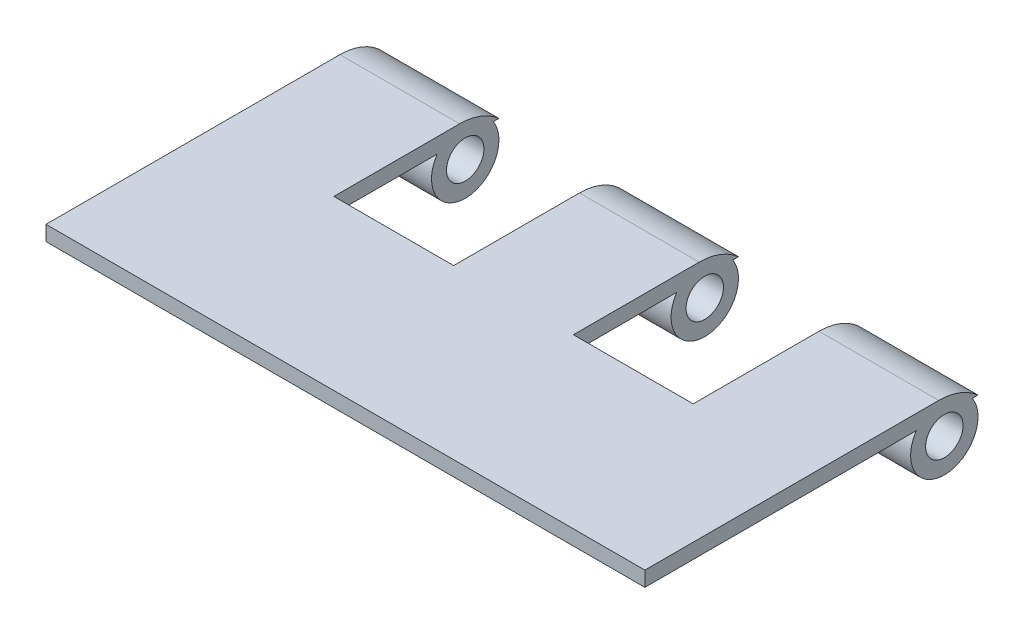
ISO-10303-21;
HEADER;
FILE_DESCRIPTION(('STEP AP214'),'2;1');
FILE_NAME('part.step','',(''),(''),'','','');
FILE_SCHEMA(('AUTOMOTIVE_DESIGN { 1 0 10303 214 1 1 1 1 }'));
ENDSEC;
DATA;
#1=APPLICATION_CONTEXT('core data for automotive mechanical design processes');
#2=APPLICATION_PROTOCOL_DEFINITION('international standard','automotive_design',2000,#1);
#3=PRODUCT_CONTEXT('',#1,'mechanical');
#4=PRODUCT('Part','Part','',(#3));
#5=PRODUCT_RELATED_PRODUCT_CATEGORY('part','',(#4));
#6=PRODUCT_DEFINITION_FORMATION('','',#4);
#7=PRODUCT_DEFINITION_CONTEXT('part definition',#1,'design');
#8=PRODUCT_DEFINITION('design','',#6,#7);
#9=PRODUCT_DEFINITION_SHAPE('','',#8);
#10=(LENGTH_UNIT() NAMED_UNIT(*) SI_UNIT(.MILLI.,.METRE.));
#11=(NAMED_UNIT(*) PLANE_ANGLE_UNIT() SI_UNIT($,.RADIAN.));
#12=(NAMED_UNIT(*) SI_UNIT($,.STERADIAN.) SOLID_ANGLE_UNIT());
#13=UNCERTAINTY_MEASURE_WITH_UNIT(LENGTH_MEASURE(1.E-05),#10,'distance_accuracy_value','');
#14=(GEOMETRIC_REPRESENTATION_CONTEXT(3) GLOBAL_UNCERTAINTY_ASSIGNED_CONTEXT((#13)) GLOBAL_UNIT_ASSIGNED_CONTEXT((#10,
#11,#12)) REPRESENTATION_CONTEXT('',''));
#15=CARTESIAN_POINT('',(0.,0.,0.));
#16=DIRECTION('',(0.,0.,1.));
#17=DIRECTION('',(1.,0.,0.));
#18=AXIS2_PLACEMENT_3D('',#15,#16,#17);
#19=CARTESIAN_POINT('',(-15.8109864269688,-0.79375,-13.4638514395932));
#20=DIRECTION('',(1.,0.,0.));
#21=DIRECTION('',(0.,0.,-1.));
#22=AXIS2_PLACEMENT_3D('',#19,#20,#21);
#23=CYLINDRICAL_SURFACE('',#22,1.42875);
#24=DIRECTION('',(1.,0.,0.));
#25=VECTOR('',#24,1.);
#26=CARTESIAN_POINT('',(-15.8109864269688,0.,-14.651827659894));
#27=LINE('',#26,#25);
#28=CARTESIAN_POINT('',(-6.68987117248764,0.,-14.651827659894));
#29=VERTEX_POINT('',#28);
#30=CARTESIAN_POINT('',(-11.7698711724876,0.,-14.651827659894));
#31=VERTEX_POINT('',#30);
#32=EDGE_CURVE('E209',#29,#31,#27,.F.);
#33=ORIENTED_EDGE('',*,*,#32,.F.);
#34=CARTESIAN_POINT('',(-6.68987117248764,-0.79375,-13.4638514395932));
#35=DIRECTION('',(-1.,0.,0.));
#36=DIRECTION('',(0.,0.,1.));
#37=AXIS2_PLACEMENT_3D('',#34,#35,#36);
#38=CIRCLE('',#37,1.42875);
#39=CARTESIAN_POINT('',(-6.68987117248764,0.,-12.2758752192925));
#40=VERTEX_POINT('',#39);
#41=EDGE_CURVE('E222',#40,#29,#38,.F.);
#42=ORIENTED_EDGE('',*,*,#41,.F.);
#43=DIRECTION('',(1.,0.,0.));
#44=VECTOR('',#43,1.);
#45=CARTESIAN_POINT('',(-15.8109864269688,0.,-12.2758752192925));
#46=LINE('',#45,#44);
#47=CARTESIAN_POINT('',(-11.7698711724876,0.,-12.2758752192925));
#48=VERTEX_POINT('',#47);
#49=EDGE_CURVE('E187',#48,#40,#46,.T.);
#50=ORIENTED_EDGE('',*,*,#49,.F.);
#51=CARTESIAN_POINT('',(-11.7698711724876,-0.79375,-13.4638514395932));
#52=DIRECTION('',(1.,0.,0.));
#53=DIRECTION('',(0.,0.,-1.));
#54=AXIS2_PLACEMENT_3D('',#51,#52,#53);
#55=CIRCLE('',#54,1.42875);
#56=EDGE_CURVE('E289',#31,#48,#55,.F.);
#57=ORIENTED_EDGE('',*,*,#56,.F.);
#58=EDGE_LOOP('',(#33,#42,#50,#57));
#59=FACE_BOUND('',#58,.T.);
#60=ADVANCED_FACE('F50',(#59),#23,.T.);
#61=CARTESIAN_POINT('',(-1.60987117248764,0.,-12.2758752192925));
#62=VERTEX_POINT('',#61);
#63=CARTESIAN_POINT('',(3.47012882751236,0.,-12.2758752192925));
#64=VERTEX_POINT('',#63);
#65=EDGE_CURVE('E203',#62,#64,#46,.T.);
#66=ORIENTED_EDGE('',*,*,#65,.F.);
#67=CARTESIAN_POINT('',(-1.60987117248764,-0.79375,-13.4638514395932));
#68=DIRECTION('',(1.,0.,0.));
#69=DIRECTION('',(0.,0.,-1.));
#70=AXIS2_PLACEMENT_3D('',#67,#68,#69);
#71=CIRCLE('',#70,1.42875);
#72=CARTESIAN_POINT('',(-1.60987117248764,0.,-14.651827659894));
#73=VERTEX_POINT('',#72);
#74=EDGE_CURVE('E277',#73,#62,#71,.F.);
#75=ORIENTED_EDGE('',*,*,#74,.F.);
#76=CARTESIAN_POINT('',(3.47012882751236,0.,-14.651827659894));
#77=VERTEX_POINT('',#76);
#78=EDGE_CURVE('E207',#77,#73,#27,.F.);
#79=ORIENTED_EDGE('',*,*,#78,.F.);
#80=CARTESIAN_POINT('',(3.47012882751236,-0.79375,-13.4638514395932));
#81=DIRECTION('',(-1.,0.,0.));
#82=DIRECTION('',(0.,0.,1.));
#83=AXIS2_PLACEMENT_3D('',#80,#81,#82);
#84=CIRCLE('',#83,1.42875);
#85=EDGE_CURVE('E186',#64,#77,#84,.F.);
#86=ORIENTED_EDGE('',*,*,#85,.F.);
#87=EDGE_LOOP('',(#66,#75,#79,#86));
#88=FACE_BOUND('',#87,.T.);
#89=ADVANCED_FACE('F363',(#88),#23,.T.);
#90=CARTESIAN_POINT('',(0.,0.,0.));
#91=DIRECTION('',(0.,1.,0.));
#92=DIRECTION('',(0.,0.,1.));
#93=AXIS2_PLACEMENT_3D('',#90,#91,#92);
#94=PLANE('',#93);
#95=DIRECTION('',(0.,0.,1.));
#96=VECTOR('',#95,1.);
#97=CARTESIAN_POINT('',(-11.7698711724876,0.,0.));
#98=LINE('',#97,#96);
#99=CARTESIAN_POINT('',(-11.7698711724876,0.,-0.763851439593247));
#100=VERTEX_POINT('',#99);
#101=EDGE_CURVE('E217',#48,#100,#98,.T.);
#102=ORIENTED_EDGE('',*,*,#101,.F.);
#103=ORIENTED_EDGE('',*,*,#49,.T.);
#104=DIRECTION('',(0.,0.,1.));
#105=VECTOR('',#104,1.);
#106=CARTESIAN_POINT('',(-6.68987117248764,0.,0.));
#107=LINE('',#106,#105);
#108=CARTESIAN_POINT('',(-6.68987117248764,0.,-7.89260143959325));
#109=VERTEX_POINT('',#108);
#110=EDGE_CURVE('E214',#40,#109,#107,.T.);
#111=ORIENTED_EDGE('',*,*,#110,.T.);
#112=DIRECTION('',(1.,0.,0.));
#113=VECTOR('',#112,1.);
#114=CARTESIAN_POINT('',(0.,0.,-7.89260143959325));
#115=LINE('',#114,#113);
#116=CARTESIAN_POINT('',(-1.60987117248764,0.,-7.89260143959325));
#117=VERTEX_POINT('',#116);
#118=EDGE_CURVE('E228',#109,#117,#115,.T.);
#119=ORIENTED_EDGE('',*,*,#118,.T.);
#120=DIRECTION('',(0.,0.,1.));
#121=VECTOR('',#120,1.);
#122=CARTESIAN_POINT('',(-1.60987117248764,0.,0.));
#123=LINE('',#122,#121);
#124=EDGE_CURVE('E281',#62,#117,#123,.T.);
#125=ORIENTED_EDGE('',*,*,#124,.F.);
#126=ORIENTED_EDGE('',*,*,#65,.T.);
#127=DIRECTION('',(0.,0.,1.));
#128=VECTOR('',#127,1.);
#129=CARTESIAN_POINT('',(3.47012882751236,0.,0.));
#130=LINE('',#129,#128);
#131=CARTESIAN_POINT('',(3.47012882751236,0.,-7.89260143959325));
#132=VERTEX_POINT('',#131);
#133=EDGE_CURVE('E285',#64,#132,#130,.T.);
#134=ORIENTED_EDGE('',*,*,#133,.T.);
#135=DIRECTION('',(1.,0.,0.));
#136=VECTOR('',#135,1.);
#137=CARTESIAN_POINT('',(0.,0.,-7.89260143959325));
#138=LINE('',#137,#136);
#139=CARTESIAN_POINT('',(8.55012882751236,0.,-7.89260143959325));
#140=VERTEX_POINT('',#139);
#141=EDGE_CURVE('E197',#132,#140,#138,.T.);
#142=ORIENTED_EDGE('',*,*,#141,.T.);
#143=DIRECTION('',(0.,0.,1.));
#144=VECTOR('',#143,1.);
#145=CARTESIAN_POINT('',(8.55012882751236,0.,0.));
#146=LINE('',#145,#144);
#147=CARTESIAN_POINT('',(8.55012882751236,0.,-12.2758752192925));
#148=VERTEX_POINT('',#147);
#149=EDGE_CURVE('E178',#148,#140,#146,.T.);
#150=ORIENTED_EDGE('',*,*,#149,.F.);
#151=CARTESIAN_POINT('',(13.6301288275124,0.,-12.2758752192925));
#152=VERTEX_POINT('',#151);
#153=EDGE_CURVE('E194',#148,#152,#46,.T.);
#154=ORIENTED_EDGE('',*,*,#153,.T.);
#155=DIRECTION('',(0.,0.,1.));
#156=VECTOR('',#155,1.);
#157=CARTESIAN_POINT('',(13.6301288275124,0.,0.));
#158=LINE('',#157,#156);
#159=CARTESIAN_POINT('',(13.6301288275124,0.,-0.763851439593247));
#160=VERTEX_POINT('',#159);
#161=EDGE_CURVE('E242',#152,#160,#158,.T.);
#162=ORIENTED_EDGE('',*,*,#161,.T.);
#163=DIRECTION('',(1.,0.,0.));
#164=VECTOR('',#163,1.);
#165=CARTESIAN_POINT('',(0.,0.,-0.763851439593247));
#166=LINE('',#165,#164);
#167=EDGE_CURVE('E239',#100,#160,#166,.T.);
#168=ORIENTED_EDGE('',*,*,#167,.F.);
#169=EDGE_LOOP('',(#102,#103,#111,#119,#125,#126,#134,#142,#150,#154,#162,#168));
#170=FACE_BOUND('',#169,.T.);
#171=ADVANCED_FACE('F193',(#170),#94,.F.);
#172=CARTESIAN_POINT('',(13.6301288275124,0.,-14.8926014395932));
#173=VERTEX_POINT('',#172);
#174=CARTESIAN_POINT('',(13.6301288275124,0.,-14.651827659894));
#175=VERTEX_POINT('',#174);
#176=EDGE_CURVE('E243',#173,#175,#158,.T.);
#177=ORIENTED_EDGE('',*,*,#176,.T.);
#178=CARTESIAN_POINT('',(8.55012882751236,0.,-14.651827659894));
#179=VERTEX_POINT('',#178);
#180=EDGE_CURVE('E204',#175,#179,#27,.F.);
#181=ORIENTED_EDGE('',*,*,#180,.T.);
#182=CARTESIAN_POINT('',(8.55012882751236,0.,-14.8926014395933));
#183=VERTEX_POINT('',#182);
#184=EDGE_CURVE('E181',#183,#179,#146,.T.);
#185=ORIENTED_EDGE('',*,*,#184,.F.);
#186=DIRECTION('',(1.,0.,0.));
#187=VECTOR('',#186,1.);
#188=CARTESIAN_POINT('',(0.,0.,-14.8926014395933));
#189=LINE('',#188,#187);
#190=EDGE_CURVE('E198',#183,#173,#189,.T.);
#191=ORIENTED_EDGE('',*,*,#190,.T.);
#192=EDGE_LOOP('',(#177,#181,#185,#191));
#193=FACE_BOUND('',#192,.T.);
#194=ADVANCED_FACE('F342',(#193),#94,.F.);
#195=CARTESIAN_POINT('',(3.47012882751236,0.,-14.8926014395933));
#196=VERTEX_POINT('',#195);
#197=EDGE_CURVE('E273',#196,#77,#130,.T.);
#198=ORIENTED_EDGE('',*,*,#197,.T.);
#199=ORIENTED_EDGE('',*,*,#78,.T.);
#200=CARTESIAN_POINT('',(-1.60987117248764,0.,-14.8926014395933));
#201=VERTEX_POINT('',#200);
#202=EDGE_CURVE('E232',#201,#73,#123,.T.);
#203=ORIENTED_EDGE('',*,*,#202,.F.);
#204=EDGE_CURVE('E282',#201,#196,#189,.T.);
#205=ORIENTED_EDGE('',*,*,#204,.T.);
#206=EDGE_LOOP('',(#198,#199,#203,#205));
#207=FACE_BOUND('',#206,.T.);
#208=ADVANCED_FACE('F270',(#207),#94,.F.);
#209=CARTESIAN_POINT('',(8.55012882751236,0.635,0.));
#210=DIRECTION('',(1.,0.,0.));
#211=DIRECTION('',(0.,0.,-1.));
#212=AXIS2_PLACEMENT_3D('',#209,#210,#211);
#213=PLANE('',#212);
#214=CARTESIAN_POINT('',(8.55012882751236,-0.79375,-13.4638514395932));
#215=DIRECTION('',(1.,0.,0.));
#216=DIRECTION('',(0.,0.,-1.));
#217=AXIS2_PLACEMENT_3D('',#214,#215,#216);
#218=CIRCLE('',#217,0.793749999999999);
#219=CARTESIAN_POINT('',(8.55012882751236,-0.79375,-14.2576014395932));
#220=VERTEX_POINT('',#219);
#221=EDGE_CURVE('E311',#220,#220,#218,.T.);
#222=ORIENTED_EDGE('',*,*,#221,.T.);
#223=EDGE_LOOP('',(#222));
#224=FACE_BOUND('',#223,.T.);
#225=DIRECTION('',(0.,0.,1.));
#226=VECTOR('',#225,1.);
#227=CARTESIAN_POINT('',(8.55012882751236,0.635,0.));
#228=LINE('',#227,#226);
#229=CARTESIAN_POINT('',(8.55012882751236,0.635,-13.2277365802128));
#230=VERTEX_POINT('',#229);
#231=CARTESIAN_POINT('',(8.55012882751236,0.635,-7.89260143959325));
#232=VERTEX_POINT('',#231);
#233=EDGE_CURVE('E245',#230,#232,#228,.T.);
#234=ORIENTED_EDGE('',*,*,#233,.F.);
#235=CARTESIAN_POINT('',(8.55012882751236,-1.865,-13.2277365802128));
#236=DIRECTION('',(1.,0.,0.));
#237=DIRECTION('',(0.,0.,-1.));
#238=AXIS2_PLACEMENT_3D('',#235,#236,#237);
#239=CIRCLE('',#238,2.5);
#240=EDGE_CURVE('E13',#230,#183,#239,.F.);
#241=ORIENTED_EDGE('',*,*,#240,.T.);
#242=ORIENTED_EDGE('',*,*,#184,.T.);
#243=CARTESIAN_POINT('',(8.55012882751236,-0.79375,-13.4638514395932));
#244=DIRECTION('',(1.,0.,0.));
#245=DIRECTION('',(0.,0.,-1.));
#246=AXIS2_PLACEMENT_3D('',#243,#244,#245);
#247=CIRCLE('',#246,1.42875);
#248=EDGE_CURVE('E173',#179,#148,#247,.F.);
#249=ORIENTED_EDGE('',*,*,#248,.T.);
#250=ORIENTED_EDGE('',*,*,#149,.T.);
#251=DIRECTION('',(0.,-1.,0.));
#252=VECTOR('',#251,1.);
#253=CARTESIAN_POINT('',(8.55012882751236,0.635,-7.89260143959325));
#254=LINE('',#253,#252);
#255=EDGE_CURVE('E260',#232,#140,#254,.T.);
#256=ORIENTED_EDGE('',*,*,#255,.F.);
#257=EDGE_LOOP('',(#234,#241,#242,#249,#250,#256));
#258=FACE_BOUND('',#257,.T.);
#259=ADVANCED_FACE('F176',(#224,#258),#213,.F.);
#260=CARTESIAN_POINT('',(0.,0.635,-7.89260143959325));
#261=DIRECTION('',(0.,0.,-1.));
#262=DIRECTION('',(-1.,0.,0.));
#263=AXIS2_PLACEMENT_3D('',#260,#261,#262);
#264=PLANE('',#263);
#265=ORIENTED_EDGE('',*,*,#141,.F.);
#266=DIRECTION('',(0.,-1.,0.));
#267=VECTOR('',#266,1.);
#268=CARTESIAN_POINT('',(3.47012882751236,0.635,-7.89260143959325));
#269=LINE('',#268,#267);
#270=CARTESIAN_POINT('',(3.47012882751236,0.635,-7.89260143959325));
#271=VERTEX_POINT('',#270);
#272=EDGE_CURVE('E257',#271,#132,#269,.T.);
#273=ORIENTED_EDGE('',*,*,#272,.F.);
#274=DIRECTION('',(1.,0.,0.));
#275=VECTOR('',#274,1.);
#276=CARTESIAN_POINT('',(0.,0.635,-7.89260143959325));
#277=LINE('',#276,#275);
#278=EDGE_CURVE('E305',#271,#232,#277,.T.);
#279=ORIENTED_EDGE('',*,*,#278,.T.);
#280=ORIENTED_EDGE('',*,*,#255,.T.);
#281=EDGE_LOOP('',(#265,#273,#279,#280));
#282=FACE_BOUND('',#281,.T.);
#283=ADVANCED_FACE('F425',(#282),#264,.T.);
#284=CARTESIAN_POINT('',(3.47012882751236,0.635,0.));
#285=DIRECTION('',(1.,0.,0.));
#286=DIRECTION('',(0.,0.,-1.));
#287=AXIS2_PLACEMENT_3D('',#284,#285,#286);
#288=PLANE('',#287);
#289=CARTESIAN_POINT('',(3.47012882751236,-0.79375,-13.4638514395932));
#290=DIRECTION('',(1.,0.,0.));
#291=DIRECTION('',(0.,0.,-1.));
#292=AXIS2_PLACEMENT_3D('',#289,#290,#291);
#293=CIRCLE('',#292,0.793749999999999);
#294=CARTESIAN_POINT('',(3.47012882751236,-0.79375,-14.2576014395932));
#295=VERTEX_POINT('',#294);
#296=EDGE_CURVE('E314',#295,#295,#293,.T.);
#297=ORIENTED_EDGE('',*,*,#296,.F.);
#298=EDGE_LOOP('',(#297));
#299=FACE_BOUND('',#298,.T.);
#300=ORIENTED_EDGE('',*,*,#197,.F.);
#301=CARTESIAN_POINT('',(3.47012882751236,-1.865,-13.2277365802128));
#302=DIRECTION('',(1.,0.,0.));
#303=DIRECTION('',(0.,0.,-1.));
#304=AXIS2_PLACEMENT_3D('',#301,#302,#303);
#305=CIRCLE('',#304,2.5);
#306=CARTESIAN_POINT('',(3.47012882751236,0.635,-13.2277365802128));
#307=VERTEX_POINT('',#306);
#308=EDGE_CURVE('E73',#196,#307,#305,.T.);
#309=ORIENTED_EDGE('',*,*,#308,.T.);
#310=DIRECTION('',(0.,0.,1.));
#311=VECTOR('',#310,1.);
#312=CARTESIAN_POINT('',(3.47012882751236,0.635,0.));
#313=LINE('',#312,#311);
#314=EDGE_CURVE('E303',#307,#271,#313,.T.);
#315=ORIENTED_EDGE('',*,*,#314,.T.);
#316=ORIENTED_EDGE('',*,*,#272,.T.);
#317=ORIENTED_EDGE('',*,*,#133,.F.);
#318=ORIENTED_EDGE('',*,*,#85,.T.);
#319=EDGE_LOOP('',(#300,#309,#315,#316,#317,#318));
#320=FACE_BOUND('',#319,.T.);
#321=ADVANCED_FACE('F362',(#299,#320),#288,.T.);
#322=CARTESIAN_POINT('',(-1.60987117248764,0.635,0.));
#323=DIRECTION('',(1.,0.,0.));
#324=DIRECTION('',(0.,0.,-1.));
#325=AXIS2_PLACEMENT_3D('',#322,#323,#324);
#326=PLANE('',#325);
#327=CARTESIAN_POINT('',(-1.60987117248764,-0.79375,-13.4638514395932));
#328=DIRECTION('',(1.,0.,0.));
#329=DIRECTION('',(0.,0.,-1.));
#330=AXIS2_PLACEMENT_3D('',#327,#328,#329);
#331=CIRCLE('',#330,0.793749999999999);
#332=CARTESIAN_POINT('',(-1.60987117248764,-0.79375,-14.2576014395932));
#333=VERTEX_POINT('',#332);
#334=EDGE_CURVE('E317',#333,#333,#331,.T.);
#335=ORIENTED_EDGE('',*,*,#334,.T.);
#336=EDGE_LOOP('',(#335));
#337=FACE_BOUND('',#336,.T.);
#338=DIRECTION('',(0.,0.,1.));
#339=VECTOR('',#338,1.);
#340=CARTESIAN_POINT('',(-1.60987117248764,0.635,0.));
#341=LINE('',#340,#339);
#342=CARTESIAN_POINT('',(-1.60987117248764,0.635,-13.2277365802128));
#343=VERTEX_POINT('',#342);
#344=CARTESIAN_POINT('',(-1.60987117248764,0.635,-7.89260143959325));
#345=VERTEX_POINT('',#344);
#346=EDGE_CURVE('E301',#343,#345,#341,.T.);
#347=ORIENTED_EDGE('',*,*,#346,.F.);
#348=CARTESIAN_POINT('',(-1.60987117248764,-1.865,-13.2277365802128));
#349=DIRECTION('',(1.,0.,0.));
#350=DIRECTION('',(0.,0.,-1.));
#351=AXIS2_PLACEMENT_3D('',#348,#349,#350);
#352=CIRCLE('',#351,2.5);
#353=EDGE_CURVE('E280',#343,#201,#352,.F.);
#354=ORIENTED_EDGE('',*,*,#353,.T.);
#355=ORIENTED_EDGE('',*,*,#202,.T.);
#356=ORIENTED_EDGE('',*,*,#74,.T.);
#357=ORIENTED_EDGE('',*,*,#124,.T.);
#358=DIRECTION('',(0.,-1.,0.));
#359=VECTOR('',#358,1.);
#360=CARTESIAN_POINT('',(-1.60987117248764,0.635,-7.89260143959325));
#361=LINE('',#360,#359);
#362=EDGE_CURVE('E254',#345,#117,#361,.T.);
#363=ORIENTED_EDGE('',*,*,#362,.F.);
#364=EDGE_LOOP('',(#347,#354,#355,#356,#357,#363));
#365=FACE_BOUND('',#364,.T.);
#366=ADVANCED_FACE('F276',(#337,#365),#326,.F.);
#367=CARTESIAN_POINT('',(0.,0.635,-7.89260143959325));
#368=DIRECTION('',(0.,0.,-1.));
#369=DIRECTION('',(-1.,0.,0.));
#370=AXIS2_PLACEMENT_3D('',#367,#368,#369);
#371=PLANE('',#370);
#372=ORIENTED_EDGE('',*,*,#118,.F.);
#373=DIRECTION('',(0.,-1.,0.));
#374=VECTOR('',#373,1.);
#375=CARTESIAN_POINT('',(-6.68987117248764,0.635,-7.89260143959325));
#376=LINE('',#375,#374);
#377=CARTESIAN_POINT('',(-6.68987117248764,0.635,-7.89260143959325));
#378=VERTEX_POINT('',#377);
#379=EDGE_CURVE('E225',#378,#109,#376,.T.);
#380=ORIENTED_EDGE('',*,*,#379,.F.);
#381=DIRECTION('',(1.,0.,0.));
#382=VECTOR('',#381,1.);
#383=CARTESIAN_POINT('',(0.,0.635,-7.89260143959325));
#384=LINE('',#383,#382);
#385=EDGE_CURVE('E298',#378,#345,#384,.T.);
#386=ORIENTED_EDGE('',*,*,#385,.T.);
#387=ORIENTED_EDGE('',*,*,#362,.T.);
#388=EDGE_LOOP('',(#372,#380,#386,#387));
#389=FACE_BOUND('',#388,.T.);
#390=ADVANCED_FACE('F367',(#389),#371,.T.);
#391=CARTESIAN_POINT('',(-6.68987117248764,0.635,0.));
#392=DIRECTION('',(1.,0.,0.));
#393=DIRECTION('',(0.,0.,-1.));
#394=AXIS2_PLACEMENT_3D('',#391,#392,#393);
#395=PLANE('',#394);
#396=CARTESIAN_POINT('',(-6.68987117248764,-0.79375,-13.4638514395932));
#397=DIRECTION('',(1.,0.,0.));
#398=DIRECTION('',(0.,0.,-1.));
#399=AXIS2_PLACEMENT_3D('',#396,#397,#398);
#400=CIRCLE('',#399,0.793749999999999);
#401=CARTESIAN_POINT('',(-6.68987117248764,-0.79375,-14.2576014395932));
#402=VERTEX_POINT('',#401);
#403=EDGE_CURVE('E320',#402,#402,#400,.T.);
#404=ORIENTED_EDGE('',*,*,#403,.F.);
#405=EDGE_LOOP('',(#404));
#406=FACE_BOUND('',#405,.T.);
#407=CARTESIAN_POINT('',(-6.68987117248764,0.,-14.8926014395933));
#408=VERTEX_POINT('',#407);
#409=EDGE_CURVE('E227',#408,#29,#107,.T.);
#410=ORIENTED_EDGE('',*,*,#409,.F.);
#411=CARTESIAN_POINT('',(-6.68987117248764,-1.865,-13.2277365802128));
#412=DIRECTION('',(1.,0.,0.));
#413=DIRECTION('',(0.,0.,-1.));
#414=AXIS2_PLACEMENT_3D('',#411,#412,#413);
#415=CIRCLE('',#414,2.5);
#416=CARTESIAN_POINT('',(-6.68987117248764,0.635,-13.2277365802128));
#417=VERTEX_POINT('',#416);
#418=EDGE_CURVE('E357',#408,#417,#415,.T.);
#419=ORIENTED_EDGE('',*,*,#418,.T.);
#420=DIRECTION('',(0.,0.,1.));
#421=VECTOR('',#420,1.);
#422=CARTESIAN_POINT('',(-6.68987117248764,0.635,0.));
#423=LINE('',#422,#421);
#424=EDGE_CURVE('E296',#417,#378,#423,.T.);
#425=ORIENTED_EDGE('',*,*,#424,.T.);
#426=ORIENTED_EDGE('',*,*,#379,.T.);
#427=ORIENTED_EDGE('',*,*,#110,.F.);
#428=ORIENTED_EDGE('',*,*,#41,.T.);
#429=EDGE_LOOP('',(#410,#419,#425,#426,#427,#428));
#430=FACE_BOUND('',#429,.T.);
#431=ADVANCED_FACE('F221',(#406,#430),#395,.T.);
#432=CARTESIAN_POINT('',(-11.7698711724876,0.635,0.));
#433=DIRECTION('',(1.,0.,0.));
#434=DIRECTION('',(0.,0.,-1.));
#435=AXIS2_PLACEMENT_3D('',#432,#433,#434);
#436=PLANE('',#435);
#437=CARTESIAN_POINT('',(-11.7698711724876,-0.79375,-13.4638514395932));
#438=DIRECTION('',(1.,0.,0.));
#439=DIRECTION('',(0.,0.,-1.));
#440=AXIS2_PLACEMENT_3D('',#437,#438,#439);
#441=CIRCLE('',#440,0.793749999999999);
#442=CARTESIAN_POINT('',(-11.7698711724876,-0.79375,-14.2576014395932));
#443=VERTEX_POINT('',#442);
#444=EDGE_CURVE('E323',#443,#443,#441,.T.);
#445=ORIENTED_EDGE('',*,*,#444,.T.);
#446=EDGE_LOOP('',(#445));
#447=FACE_BOUND('',#446,.T.);
#448=DIRECTION('',(0.,0.,1.));
#449=VECTOR('',#448,1.);
#450=CARTESIAN_POINT('',(-11.7698711724876,0.635,0.));
#451=LINE('',#450,#449);
#452=CARTESIAN_POINT('',(-11.7698711724876,0.635,-13.2277365802128));
#453=VERTEX_POINT('',#452);
#454=CARTESIAN_POINT('',(-11.7698711724876,0.635,-0.763851439593247));
#455=VERTEX_POINT('',#454);
#456=EDGE_CURVE('E294',#453,#455,#451,.T.);
#457=ORIENTED_EDGE('',*,*,#456,.F.);
#458=CARTESIAN_POINT('',(-11.7698711724876,-1.865,-13.2277365802128));
#459=DIRECTION('',(1.,0.,0.));
#460=DIRECTION('',(0.,0.,-1.));
#461=AXIS2_PLACEMENT_3D('',#458,#459,#460);
#462=CIRCLE('',#461,2.5);
#463=CARTESIAN_POINT('',(-11.7698711724876,0.,-14.8926014395933));
#464=VERTEX_POINT('',#463);
#465=EDGE_CURVE('E351',#453,#464,#462,.F.);
#466=ORIENTED_EDGE('',*,*,#465,.T.);
#467=EDGE_CURVE('E236',#464,#31,#98,.T.);
#468=ORIENTED_EDGE('',*,*,#467,.T.);
#469=ORIENTED_EDGE('',*,*,#56,.T.);
#470=ORIENTED_EDGE('',*,*,#101,.T.);
#471=DIRECTION('',(0.,-1.,0.));
#472=VECTOR('',#471,1.);
#473=CARTESIAN_POINT('',(-11.7698711724876,0.635,-0.763851439593247));
#474=LINE('',#473,#472);
#475=EDGE_CURVE('E249',#455,#100,#474,.T.);
#476=ORIENTED_EDGE('',*,*,#475,.F.);
#477=EDGE_LOOP('',(#457,#466,#468,#469,#470,#476));
#478=FACE_BOUND('',#477,.T.);
#479=ADVANCED_FACE('F378',(#447,#478),#436,.F.);
#480=CARTESIAN_POINT('',(0.,0.635,-0.763851439593247));
#481=DIRECTION('',(0.,0.,-1.));
#482=DIRECTION('',(-1.,0.,0.));
#483=AXIS2_PLACEMENT_3D('',#480,#481,#482);
#484=PLANE('',#483);
#485=ORIENTED_EDGE('',*,*,#167,.T.);
#486=DIRECTION('',(0.,-1.,0.));
#487=VECTOR('',#486,1.);
#488=CARTESIAN_POINT('',(13.6301288275124,0.635,-0.763851439593247));
#489=LINE('',#488,#487);
#490=CARTESIAN_POINT('',(13.6301288275124,0.635,-0.763851439593247));
#491=VERTEX_POINT('',#490);
#492=EDGE_CURVE('E246',#491,#160,#489,.T.);
#493=ORIENTED_EDGE('',*,*,#492,.F.);
#494=DIRECTION('',(1.,0.,0.));
#495=VECTOR('',#494,1.);
#496=CARTESIAN_POINT('',(0.,0.635,-0.763851439593247));
#497=LINE('',#496,#495);
#498=EDGE_CURVE('E291',#455,#491,#497,.T.);
#499=ORIENTED_EDGE('',*,*,#498,.F.);
#500=ORIENTED_EDGE('',*,*,#475,.T.);
#501=EDGE_LOOP('',(#485,#493,#499,#500));
#502=FACE_BOUND('',#501,.T.);
#503=ADVANCED_FACE('F337',(#502),#484,.F.);
#504=CARTESIAN_POINT('',(13.6301288275124,0.635,0.));
#505=DIRECTION('',(1.,0.,0.));
#506=DIRECTION('',(0.,0.,-1.));
#507=AXIS2_PLACEMENT_3D('',#504,#505,#506);
#508=PLANE('',#507);
#509=CARTESIAN_POINT('',(13.6301288275124,-0.79375,-13.4638514395932));
#510=DIRECTION('',(1.,0.,0.));
#511=DIRECTION('',(0.,0.,-1.));
#512=AXIS2_PLACEMENT_3D('',#509,#510,#511);
#513=CIRCLE('',#512,0.793749999999999);
#514=CARTESIAN_POINT('',(13.6301288275124,-0.79375,-14.2576014395932));
#515=VERTEX_POINT('',#514);
#516=EDGE_CURVE('E326',#515,#515,#513,.T.);
#517=ORIENTED_EDGE('',*,*,#516,.F.);
#518=EDGE_LOOP('',(#517));
#519=FACE_BOUND('',#518,.T.);
#520=ORIENTED_EDGE('',*,*,#176,.F.);
#521=CARTESIAN_POINT('',(13.6301288275124,-1.865,-13.2277365802128));
#522=DIRECTION('',(1.,0.,0.));
#523=DIRECTION('',(0.,0.,-1.));
#524=AXIS2_PLACEMENT_3D('',#521,#522,#523);
#525=CIRCLE('',#524,2.5);
#526=CARTESIAN_POINT('',(13.6301288275124,0.635,-13.2277365802128));
#527=VERTEX_POINT('',#526);
#528=EDGE_CURVE('E58',#173,#527,#525,.T.);
#529=ORIENTED_EDGE('',*,*,#528,.T.);
#530=DIRECTION('',(0.,0.,1.));
#531=VECTOR('',#530,1.);
#532=CARTESIAN_POINT('',(13.6301288275124,0.635,0.));
#533=LINE('',#532,#531);
#534=EDGE_CURVE('E250',#527,#491,#533,.T.);
#535=ORIENTED_EDGE('',*,*,#534,.T.);
#536=ORIENTED_EDGE('',*,*,#492,.T.);
#537=ORIENTED_EDGE('',*,*,#161,.F.);
#538=CARTESIAN_POINT('',(13.6301288275124,-0.79375,-13.4638514395932));
#539=DIRECTION('',(1.,0.,0.));
#540=DIRECTION('',(0.,0.,-1.));
#541=AXIS2_PLACEMENT_3D('',#538,#539,#540);
#542=CIRCLE('',#541,1.42875);
#543=EDGE_CURVE('E202',#152,#175,#542,.T.);
#544=ORIENTED_EDGE('',*,*,#543,.T.);
#545=EDGE_LOOP('',(#520,#529,#535,#536,#537,#544));
#546=FACE_BOUND('',#545,.T.);
#547=ADVANCED_FACE('F333',(#519,#546),#508,.T.);
#548=CARTESIAN_POINT('',(0.,0.635,0.));
#549=DIRECTION('',(0.,1.,0.));
#550=DIRECTION('',(0.,0.,1.));
#551=AXIS2_PLACEMENT_3D('',#548,#549,#550);
#552=PLANE('',#551);
#553=ORIENTED_EDGE('',*,*,#424,.F.);
#554=DIRECTION('',(-1.,0.,0.));
#555=VECTOR('',#554,1.);
#556=CARTESIAN_POINT('',(-11.7698711724876,0.635,-13.2277365802128));
#557=LINE('',#556,#555);
#558=EDGE_CURVE('E353',#417,#453,#557,.T.);
#559=ORIENTED_EDGE('',*,*,#558,.T.);
#560=ORIENTED_EDGE('',*,*,#456,.T.);
#561=ORIENTED_EDGE('',*,*,#498,.T.);
#562=ORIENTED_EDGE('',*,*,#534,.F.);
#563=DIRECTION('',(-1.,0.,0.));
#564=VECTOR('',#563,1.);
#565=CARTESIAN_POINT('',(8.55012882751236,0.635,-13.2277365802128));
#566=LINE('',#565,#564);
#567=EDGE_CURVE('E347',#527,#230,#566,.T.);
#568=ORIENTED_EDGE('',*,*,#567,.T.);
#569=ORIENTED_EDGE('',*,*,#233,.T.);
#570=ORIENTED_EDGE('',*,*,#278,.F.);
#571=ORIENTED_EDGE('',*,*,#314,.F.);
#572=DIRECTION('',(-1.,0.,0.));
#573=VECTOR('',#572,1.);
#574=CARTESIAN_POINT('',(-1.60987117248764,0.635,-13.2277365802128));
#575=LINE('',#574,#573);
#576=EDGE_CURVE('E65',#307,#343,#575,.T.);
#577=ORIENTED_EDGE('',*,*,#576,.T.);
#578=ORIENTED_EDGE('',*,*,#346,.T.);
#579=ORIENTED_EDGE('',*,*,#385,.F.);
#580=EDGE_LOOP('',(#553,#559,#560,#561,#562,#568,#569,#570,#571,#577,#578,#579));
#581=FACE_BOUND('',#580,.T.);
#582=ADVANCED_FACE('F336',(#581),#552,.T.);
#583=ORIENTED_EDGE('',*,*,#409,.T.);
#584=ORIENTED_EDGE('',*,*,#32,.T.);
#585=ORIENTED_EDGE('',*,*,#467,.F.);
#586=EDGE_CURVE('E231',#464,#408,#189,.T.);
#587=ORIENTED_EDGE('',*,*,#586,.T.);
#588=EDGE_LOOP('',(#583,#584,#585,#587));
#589=FACE_BOUND('',#588,.T.);
#590=ADVANCED_FACE('F385',(#589),#94,.F.);
#591=ORIENTED_EDGE('',*,*,#153,.F.);
#592=ORIENTED_EDGE('',*,*,#248,.F.);
#593=ORIENTED_EDGE('',*,*,#180,.F.);
#594=ORIENTED_EDGE('',*,*,#543,.F.);
#595=EDGE_LOOP('',(#591,#592,#593,#594));
#596=FACE_BOUND('',#595,.T.);
#597=ADVANCED_FACE('F200',(#596),#23,.T.);
#598=CARTESIAN_POINT('',(-26.3698711724876,-0.79375,-13.4638514395932));
#599=DIRECTION('',(1.,0.,0.));
#600=DIRECTION('',(0.,0.,-1.));
#601=AXIS2_PLACEMENT_3D('',#598,#599,#600);
#602=CYLINDRICAL_SURFACE('',#601,0.793749999999999);
#603=ORIENTED_EDGE('',*,*,#516,.T.);
#604=EDGE_LOOP('',(#603));
#605=FACE_BOUND('',#604,.T.);
#606=ORIENTED_EDGE('',*,*,#221,.F.);
#607=EDGE_LOOP('',(#606));
#608=FACE_BOUND('',#607,.T.);
#609=ADVANCED_FACE('F330',(#605,#608),#602,.F.);
#610=ORIENTED_EDGE('',*,*,#403,.T.);
#611=EDGE_LOOP('',(#610));
#612=FACE_BOUND('',#611,.T.);
#613=ORIENTED_EDGE('',*,*,#444,.F.);
#614=EDGE_LOOP('',(#613));
#615=FACE_BOUND('',#614,.T.);
#616=ADVANCED_FACE('F402',(#612,#615),#602,.F.);
#617=ORIENTED_EDGE('',*,*,#296,.T.);
#618=EDGE_LOOP('',(#617));
#619=FACE_BOUND('',#618,.T.);
#620=ORIENTED_EDGE('',*,*,#334,.F.);
#621=EDGE_LOOP('',(#620));
#622=FACE_BOUND('',#621,.T.);
#623=ADVANCED_FACE('F403',(#619,#622),#602,.F.);
#624=CARTESIAN_POINT('',(0.,-1.865,-13.2277365802128));
#625=DIRECTION('',(1.,0.,0.));
#626=DIRECTION('',(0.,0.,-1.));
#627=AXIS2_PLACEMENT_3D('',#624,#625,#626);
#628=CYLINDRICAL_SURFACE('',#627,2.5);
#629=ORIENTED_EDGE('',*,*,#465,.F.);
#630=ORIENTED_EDGE('',*,*,#558,.F.);
#631=ORIENTED_EDGE('',*,*,#418,.F.);
#632=ORIENTED_EDGE('',*,*,#586,.F.);
#633=EDGE_LOOP('',(#629,#630,#631,#632));
#634=FACE_BOUND('',#633,.T.);
#635=ADVANCED_FACE('F384',(#634),#628,.T.);
#636=CARTESIAN_POINT('',(0.,-1.865,-13.2277365802128));
#637=DIRECTION('',(1.,0.,0.));
#638=DIRECTION('',(0.,0.,-1.));
#639=AXIS2_PLACEMENT_3D('',#636,#637,#638);
#640=CYLINDRICAL_SURFACE('',#639,2.5);
#641=ORIENTED_EDGE('',*,*,#353,.F.);
#642=ORIENTED_EDGE('',*,*,#576,.F.);
#643=ORIENTED_EDGE('',*,*,#308,.F.);
#644=ORIENTED_EDGE('',*,*,#204,.F.);
#645=EDGE_LOOP('',(#641,#642,#643,#644));
#646=FACE_BOUND('',#645,.T.);
#647=ADVANCED_FACE('F372',(#646),#640,.T.);
#648=CARTESIAN_POINT('',(0.,-1.865,-13.2277365802128));
#649=DIRECTION('',(1.,0.,0.));
#650=DIRECTION('',(0.,0.,-1.));
#651=AXIS2_PLACEMENT_3D('',#648,#649,#650);
#652=CYLINDRICAL_SURFACE('',#651,2.5);
#653=ORIENTED_EDGE('',*,*,#240,.F.);
#654=ORIENTED_EDGE('',*,*,#567,.F.);
#655=ORIENTED_EDGE('',*,*,#528,.F.);
#656=ORIENTED_EDGE('',*,*,#190,.F.);
#657=EDGE_LOOP('',(#653,#654,#655,#656));
#658=FACE_BOUND('',#657,.T.);
#659=ADVANCED_FACE('F52',(#658),#652,.T.);
#660=CLOSED_SHELL('',(#60,#89,#171,#194,#208,#259,#283,#321,#366,#390,#431,#479,#503,#547,#582,
#590,#597,#609,#616,#623,#635,#647,#659));
#661=MANIFOLD_SOLID_BREP('B2',#660);
#662=ADVANCED_BREP_SHAPE_REPRESENTATION('',(#18,#661),#14);
#663=SHAPE_DEFINITION_REPRESENTATION(#9,#662);
ENDSEC;
END-ISO-10303-21;
